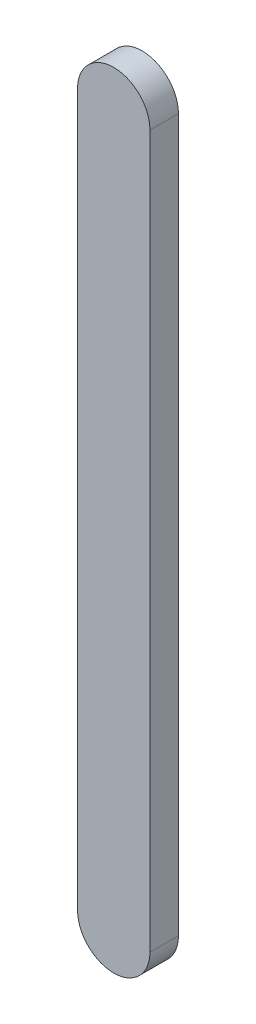
ISO-10303-21;
HEADER;
FILE_DESCRIPTION(('STEP AP214'),'2;1');
FILE_NAME('part.step','',(''),(''),'','','');
FILE_SCHEMA(('AUTOMOTIVE_DESIGN { 1 0 10303 214 1 1 1 1 }'));
ENDSEC;
DATA;
#1=APPLICATION_CONTEXT('core data for automotive mechanical design processes');
#2=APPLICATION_PROTOCOL_DEFINITION('international standard','automotive_design',2000,#1);
#3=PRODUCT_CONTEXT('',#1,'mechanical');
#4=PRODUCT('Part','Part','',(#3));
#5=PRODUCT_RELATED_PRODUCT_CATEGORY('part','',(#4));
#6=PRODUCT_DEFINITION_FORMATION('','',#4);
#7=PRODUCT_DEFINITION_CONTEXT('part definition',#1,'design');
#8=PRODUCT_DEFINITION('design','',#6,#7);
#9=PRODUCT_DEFINITION_SHAPE('','',#8);
#10=(LENGTH_UNIT() NAMED_UNIT(*) SI_UNIT(.MILLI.,.METRE.));
#11=(NAMED_UNIT(*) PLANE_ANGLE_UNIT() SI_UNIT($,.RADIAN.));
#12=(NAMED_UNIT(*) SI_UNIT($,.STERADIAN.) SOLID_ANGLE_UNIT());
#13=UNCERTAINTY_MEASURE_WITH_UNIT(LENGTH_MEASURE(1.E-05),#10,'distance_accuracy_value','');
#14=(GEOMETRIC_REPRESENTATION_CONTEXT(3) GLOBAL_UNCERTAINTY_ASSIGNED_CONTEXT((#13)) GLOBAL_UNIT_ASSIGNED_CONTEXT((#10,
#11,#12)) REPRESENTATION_CONTEXT('',''));
#15=CARTESIAN_POINT('',(0.,0.,0.));
#16=DIRECTION('',(0.,0.,1.));
#17=DIRECTION('',(1.,0.,0.));
#18=AXIS2_PLACEMENT_3D('',#15,#16,#17);
#19=CARTESIAN_POINT('',(115.7986,71.6026,0.));
#20=DIRECTION('',(-1.,0.,0.));
#21=DIRECTION('',(0.,1.,0.));
#22=AXIS2_PLACEMENT_3D('',#19,#20,#21);
#23=PLANE('',#22);
#24=DIRECTION('',(0.,1.,0.));
#25=VECTOR('',#24,1.);
#26=CARTESIAN_POINT('',(115.7986,71.6026,0.1999996));
#27=LINE('',#26,#25);
#28=CARTESIAN_POINT('',(115.7986,71.6026,0.1999996));
#29=VERTEX_POINT('',#28);
#30=CARTESIAN_POINT('',(115.7986,76.5991356,0.1999996));
#31=VERTEX_POINT('',#30);
#32=EDGE_CURVE('E11',#29,#31,#27,.T.);
#33=ORIENTED_EDGE('',*,*,#32,.F.);
#34=DIRECTION('',(0.,0.,1.));
#35=VECTOR('',#34,1.);
#36=CARTESIAN_POINT('',(115.7986,71.6026,0.));
#37=LINE('',#36,#35);
#38=CARTESIAN_POINT('',(115.7986,71.6026,0.));
#39=VERTEX_POINT('',#38);
#40=EDGE_CURVE('E24',#39,#29,#37,.T.);
#41=ORIENTED_EDGE('',*,*,#40,.F.);
#42=DIRECTION('',(0.,1.,0.));
#43=VECTOR('',#42,1.);
#44=CARTESIAN_POINT('',(115.7986,71.6026,0.));
#45=LINE('',#44,#43);
#46=CARTESIAN_POINT('',(115.7986,76.5991356,0.));
#47=VERTEX_POINT('',#46);
#48=EDGE_CURVE('E75',#39,#47,#45,.T.);
#49=ORIENTED_EDGE('',*,*,#48,.T.);
#50=DIRECTION('',(0.,0.,1.));
#51=VECTOR('',#50,1.);
#52=CARTESIAN_POINT('',(115.7986,76.5991356,0.));
#53=LINE('',#52,#51);
#54=EDGE_CURVE('E37',#47,#31,#53,.T.);
#55=ORIENTED_EDGE('',*,*,#54,.T.);
#56=EDGE_LOOP('',(#33,#41,#49,#55));
#57=FACE_BOUND('',#56,.T.);
#58=ADVANCED_FACE('F17',(#57),#23,.F.);
#59=CARTESIAN_POINT('',(115.5446,76.5991356,0.));
#60=DIRECTION('',(0.,0.,-1.));
#61=DIRECTION('',(1.,0.,0.));
#62=AXIS2_PLACEMENT_3D('',#59,#60,#61);
#63=CYLINDRICAL_SURFACE('',#62,0.254);
#64=CARTESIAN_POINT('',(115.5446,76.5991356,0.1999996));
#65=DIRECTION('',(0.,0.,1.));
#66=DIRECTION('',(1.,0.,0.));
#67=AXIS2_PLACEMENT_3D('',#64,#65,#66);
#68=CIRCLE('',#67,0.254);
#69=CARTESIAN_POINT('',(115.2906,76.5991356,0.1999996));
#70=VERTEX_POINT('',#69);
#71=EDGE_CURVE('E83',#31,#70,#68,.T.);
#72=ORIENTED_EDGE('',*,*,#71,.F.);
#73=ORIENTED_EDGE('',*,*,#54,.F.);
#74=CARTESIAN_POINT('',(115.5446,76.5991356,0.));
#75=DIRECTION('',(0.,0.,1.));
#76=DIRECTION('',(1.,0.,0.));
#77=AXIS2_PLACEMENT_3D('',#74,#75,#76);
#78=CIRCLE('',#77,0.254);
#79=CARTESIAN_POINT('',(115.2906,76.5991356,0.));
#80=VERTEX_POINT('',#79);
#81=EDGE_CURVE('E81',#47,#80,#78,.T.);
#82=ORIENTED_EDGE('',*,*,#81,.T.);
#83=DIRECTION('',(0.,0.,1.));
#84=VECTOR('',#83,1.);
#85=CARTESIAN_POINT('',(115.2906,76.5991356,0.));
#86=LINE('',#85,#84);
#87=EDGE_CURVE('E67',#80,#70,#86,.T.);
#88=ORIENTED_EDGE('',*,*,#87,.T.);
#89=EDGE_LOOP('',(#72,#73,#82,#88));
#90=FACE_BOUND('',#89,.T.);
#91=ADVANCED_FACE('F89',(#90),#63,.T.);
#92=CARTESIAN_POINT('',(115.2906,76.5991356,0.));
#93=DIRECTION('',(1.,0.,0.));
#94=DIRECTION('',(0.,-1.,0.));
#95=AXIS2_PLACEMENT_3D('',#92,#93,#94);
#96=PLANE('',#95);
#97=DIRECTION('',(0.,-1.,0.));
#98=VECTOR('',#97,1.);
#99=CARTESIAN_POINT('',(115.2906,76.5991356,0.1999996));
#100=LINE('',#99,#98);
#101=CARTESIAN_POINT('',(115.2906,71.6026,0.1999996));
#102=VERTEX_POINT('',#101);
#103=EDGE_CURVE('E71',#70,#102,#100,.T.);
#104=ORIENTED_EDGE('',*,*,#103,.F.);
#105=ORIENTED_EDGE('',*,*,#87,.F.);
#106=DIRECTION('',(0.,-1.,0.));
#107=VECTOR('',#106,1.);
#108=CARTESIAN_POINT('',(115.2906,76.5991356,0.));
#109=LINE('',#108,#107);
#110=CARTESIAN_POINT('',(115.2906,71.6026,0.));
#111=VERTEX_POINT('',#110);
#112=EDGE_CURVE('E63',#80,#111,#109,.T.);
#113=ORIENTED_EDGE('',*,*,#112,.T.);
#114=DIRECTION('',(0.,0.,1.));
#115=VECTOR('',#114,1.);
#116=CARTESIAN_POINT('',(115.2906,71.6026,0.));
#117=LINE('',#116,#115);
#118=EDGE_CURVE('E53',#111,#102,#117,.T.);
#119=ORIENTED_EDGE('',*,*,#118,.T.);
#120=EDGE_LOOP('',(#104,#105,#113,#119));
#121=FACE_BOUND('',#120,.T.);
#122=ADVANCED_FACE('F66',(#121),#96,.F.);
#123=CARTESIAN_POINT('',(115.5446,71.6026,0.));
#124=DIRECTION('',(0.,0.,-1.));
#125=DIRECTION('',(-1.,0.,0.));
#126=AXIS2_PLACEMENT_3D('',#123,#124,#125);
#127=CYLINDRICAL_SURFACE('',#126,0.254);
#128=CARTESIAN_POINT('',(115.5446,71.6026,0.1999996));
#129=DIRECTION('',(0.,0.,1.));
#130=DIRECTION('',(-1.,0.,0.));
#131=AXIS2_PLACEMENT_3D('',#128,#129,#130);
#132=CIRCLE('',#131,0.254);
#133=EDGE_CURVE('E59',#102,#29,#132,.T.);
#134=ORIENTED_EDGE('',*,*,#133,.F.);
#135=ORIENTED_EDGE('',*,*,#118,.F.);
#136=CARTESIAN_POINT('',(115.5446,71.6026,0.));
#137=DIRECTION('',(0.,0.,1.));
#138=DIRECTION('',(-1.,0.,0.));
#139=AXIS2_PLACEMENT_3D('',#136,#137,#138);
#140=CIRCLE('',#139,0.254);
#141=EDGE_CURVE('E57',#111,#39,#140,.T.);
#142=ORIENTED_EDGE('',*,*,#141,.T.);
#143=ORIENTED_EDGE('',*,*,#40,.T.);
#144=EDGE_LOOP('',(#134,#135,#142,#143));
#145=FACE_BOUND('',#144,.T.);
#146=ADVANCED_FACE('F55',(#145),#127,.T.);
#147=CARTESIAN_POINT('',(115.7986,71.6026,0.));
#148=DIRECTION('',(0.,0.,-1.));
#149=DIRECTION('',(-1.,0.,0.));
#150=AXIS2_PLACEMENT_3D('',#147,#148,#149);
#151=PLANE('',#150);
#152=ORIENTED_EDGE('',*,*,#141,.F.);
#153=ORIENTED_EDGE('',*,*,#112,.F.);
#154=ORIENTED_EDGE('',*,*,#81,.F.);
#155=ORIENTED_EDGE('',*,*,#48,.F.);
#156=EDGE_LOOP('',(#152,#153,#154,#155));
#157=FACE_BOUND('',#156,.T.);
#158=ADVANCED_FACE('F74',(#157),#151,.T.);
#159=CARTESIAN_POINT('',(115.7986,71.6026,0.1999996));
#160=DIRECTION('',(0.,0.,-1.));
#161=DIRECTION('',(-1.,0.,0.));
#162=AXIS2_PLACEMENT_3D('',#159,#160,#161);
#163=PLANE('',#162);
#164=ORIENTED_EDGE('',*,*,#32,.T.);
#165=ORIENTED_EDGE('',*,*,#71,.T.);
#166=ORIENTED_EDGE('',*,*,#103,.T.);
#167=ORIENTED_EDGE('',*,*,#133,.T.);
#168=EDGE_LOOP('',(#164,#165,#166,#167));
#169=FACE_BOUND('',#168,.T.);
#170=ADVANCED_FACE('F91',(#169),#163,.F.);
#171=CLOSED_SHELL('',(#58,#91,#122,#146,#158,#170));
#172=MANIFOLD_SOLID_BREP('B1',#171);
#173=ADVANCED_BREP_SHAPE_REPRESENTATION('',(#18,#172),#14);
#174=SHAPE_DEFINITION_REPRESENTATION(#9,#173);
ENDSEC;
END-ISO-10303-21;
